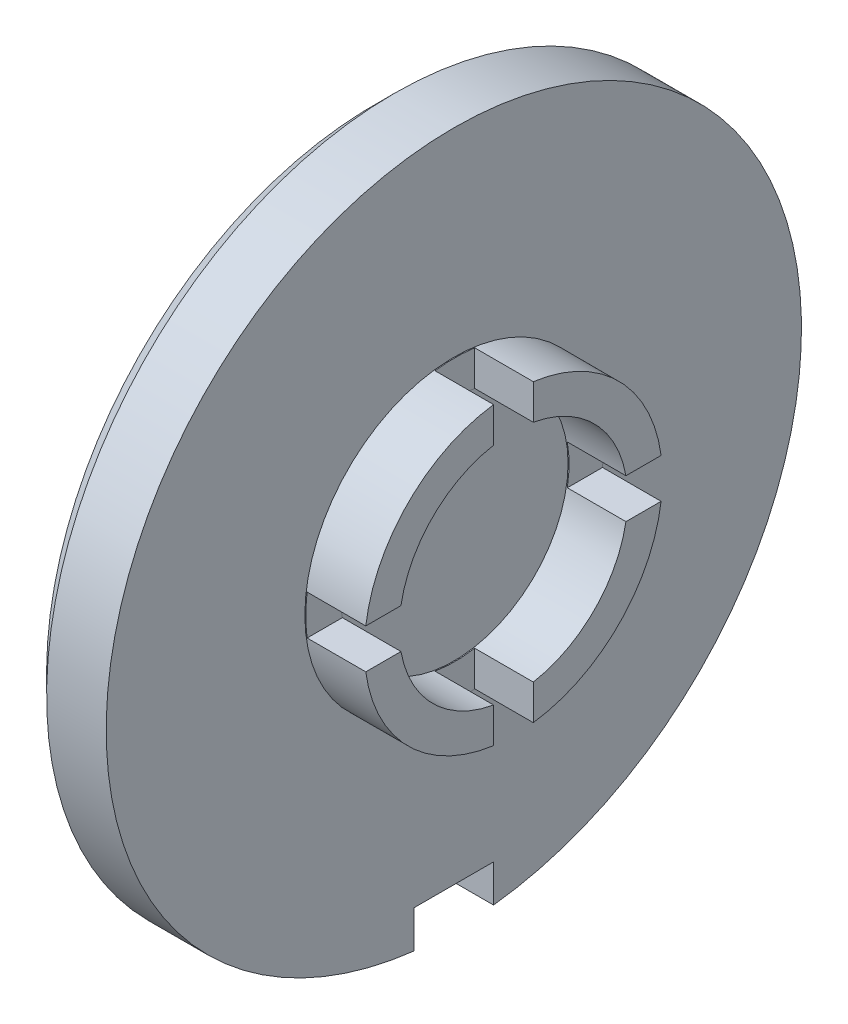
ISO-10303-21;
HEADER;
FILE_DESCRIPTION(('STEP AP214'),'2;1');
FILE_NAME('part.step','',(''),(''),'','','');
FILE_SCHEMA(('AUTOMOTIVE_DESIGN { 1 0 10303 214 1 1 1 1 }'));
ENDSEC;
DATA;
#1=APPLICATION_CONTEXT('core data for automotive mechanical design processes');
#2=APPLICATION_PROTOCOL_DEFINITION('international standard','automotive_design',2000,#1);
#3=PRODUCT_CONTEXT('',#1,'mechanical');
#4=PRODUCT('Part','Part','',(#3));
#5=PRODUCT_RELATED_PRODUCT_CATEGORY('part','',(#4));
#6=PRODUCT_DEFINITION_FORMATION('','',#4);
#7=PRODUCT_DEFINITION_CONTEXT('part definition',#1,'design');
#8=PRODUCT_DEFINITION('design','',#6,#7);
#9=PRODUCT_DEFINITION_SHAPE('','',#8);
#10=(LENGTH_UNIT() NAMED_UNIT(*) SI_UNIT(.MILLI.,.METRE.));
#11=(NAMED_UNIT(*) PLANE_ANGLE_UNIT() SI_UNIT($,.RADIAN.));
#12=(NAMED_UNIT(*) SI_UNIT($,.STERADIAN.) SOLID_ANGLE_UNIT());
#13=UNCERTAINTY_MEASURE_WITH_UNIT(LENGTH_MEASURE(1.E-05),#10,'distance_accuracy_value','');
#14=(GEOMETRIC_REPRESENTATION_CONTEXT(3) GLOBAL_UNCERTAINTY_ASSIGNED_CONTEXT((#13)) GLOBAL_UNIT_ASSIGNED_CONTEXT((#10,
#11,#12)) REPRESENTATION_CONTEXT('',''));
#15=CARTESIAN_POINT('',(0.,0.,0.));
#16=DIRECTION('',(0.,0.,1.));
#17=DIRECTION('',(1.,0.,0.));
#18=AXIS2_PLACEMENT_3D('',#15,#16,#17);
#19=CARTESIAN_POINT('',(-85.6,-65.,66.));
#20=DIRECTION('',(1.,0.,0.));
#21=DIRECTION('',(0.,0.,-1.));
#22=AXIS2_PLACEMENT_3D('',#19,#20,#21);
#23=PLANE('',#22);
#24=DIRECTION('',(0.,1.,0.));
#25=VECTOR('',#24,1.);
#26=CARTESIAN_POINT('',(-85.6,-65.,66.8));
#27=LINE('',#26,#25);
#28=CARTESIAN_POINT('',(-85.6,-71.5513357416637,66.8));
#29=VERTEX_POINT('',#28);
#30=CARTESIAN_POINT('',(-85.6,-71.2,66.8));
#31=VERTEX_POINT('',#30);
#32=EDGE_CURVE('E359',#29,#31,#27,.T.);
#33=ORIENTED_EDGE('',*,*,#32,.F.);
#34=CARTESIAN_POINT('',(-85.6,-65.,66.));
#35=DIRECTION('',(-1.,0.,0.));
#36=DIRECTION('',(0.,0.,1.));
#37=AXIS2_PLACEMENT_3D('',#34,#35,#36);
#38=CIRCLE('',#37,6.6);
#39=CARTESIAN_POINT('',(-85.6,-71.5513357416637,65.2));
#40=VERTEX_POINT('',#39);
#41=EDGE_CURVE('E260',#29,#40,#38,.T.);
#42=ORIENTED_EDGE('',*,*,#41,.T.);
#43=DIRECTION('',(0.,1.,0.));
#44=VECTOR('',#43,1.);
#45=CARTESIAN_POINT('',(-85.6,-65.,65.2));
#46=LINE('',#45,#44);
#47=CARTESIAN_POINT('',(-85.6,-71.2,65.2));
#48=VERTEX_POINT('',#47);
#49=EDGE_CURVE('E395',#40,#48,#46,.T.);
#50=ORIENTED_EDGE('',*,*,#49,.T.);
#51=DIRECTION('',(0.,0.,-1.));
#52=VECTOR('',#51,1.);
#53=CARTESIAN_POINT('',(-85.6,-71.2,66.));
#54=LINE('',#53,#52);
#55=EDGE_CURVE('E205',#31,#48,#54,.T.);
#56=ORIENTED_EDGE('',*,*,#55,.F.);
#57=EDGE_LOOP('',(#33,#42,#50,#56));
#58=FACE_BOUND('',#57,.T.);
#59=ADVANCED_FACE('F47',(#58),#23,.F.);
#60=CARTESIAN_POINT('',(-85.2,-65.,66.));
#61=DIRECTION('',(1.,0.,0.));
#62=DIRECTION('',(0.,0.,-1.));
#63=AXIS2_PLACEMENT_3D('',#60,#61,#62);
#64=CONICAL_SURFACE('',#63,7.,0.785398163397466);
#65=CARTESIAN_POINT('',(-84.3053728090001,-72.8539886990545,66.8));
#66=CARTESIAN_POINT('',(-84.4879933170182,-72.6704216279594,66.8));
#67=CARTESIAN_POINT('',(-84.6705824210977,-72.4868233002689,66.8));
#68=CARTESIAN_POINT('',(-85.0356779759848,-72.1195446095986,66.8));
#69=CARTESIAN_POINT('',(-85.2181844268204,-71.9358642466467,66.8));
#70=CARTESIAN_POINT('',(-85.5830949808418,-71.5684018115597,66.8));
#71=CARTESIAN_POINT('',(-85.7654990840124,-71.3846197394094,66.8));
#72=CARTESIAN_POINT('',(-86.1301724326838,-71.0169217300399,66.8));
#73=CARTESIAN_POINT('',(-86.3124416781385,-70.8330057927748,66.8));
#74=CARTESIAN_POINT('',(-86.4946271909999,-70.6490068941078,66.8));
#75=B_SPLINE_CURVE_WITH_KNOTS('',3,(#65,#66,#67,#68,#69,#70,#71,#72,#73,#74),.UNSPECIFIED.,.F.,
.F.,(4,2,2,2,4),(0.,0.776803766800077,1.55360727032155,2.33041088964957,3.10721477439802),.UNSPECIFIED.);
#76=CARTESIAN_POINT('',(-85.2,-71.9541354602855,66.8));
#77=VERTEX_POINT('',#76);
#78=EDGE_CURVE('E362',#77,#29,#75,.T.);
#79=ORIENTED_EDGE('',*,*,#78,.F.);
#80=CARTESIAN_POINT('',(-85.2,-65.,66.));
#81=DIRECTION('',(-1.,0.,0.));
#82=DIRECTION('',(0.,0.,1.));
#83=AXIS2_PLACEMENT_3D('',#80,#81,#82);
#84=CIRCLE('',#83,7.);
#85=CARTESIAN_POINT('',(-85.2,-71.9541354602855,65.2));
#86=VERTEX_POINT('',#85);
#87=EDGE_CURVE('E264',#77,#86,#84,.T.);
#88=ORIENTED_EDGE('',*,*,#87,.T.);
#89=CARTESIAN_POINT('',(-84.3053728090001,-72.8539886990545,65.2));
#90=CARTESIAN_POINT('',(-84.4879933170182,-72.6704216279594,65.2));
#91=CARTESIAN_POINT('',(-84.6705824210977,-72.4868233002689,65.2));
#92=CARTESIAN_POINT('',(-85.0356779759848,-72.1195446095986,65.2));
#93=CARTESIAN_POINT('',(-85.2181844268204,-71.9358642466467,65.2));
#94=CARTESIAN_POINT('',(-85.5830949808418,-71.5684018115597,65.2));
#95=CARTESIAN_POINT('',(-85.7654990840124,-71.3846197394094,65.2));
#96=CARTESIAN_POINT('',(-86.1301724326838,-71.0169217300399,65.2));
#97=CARTESIAN_POINT('',(-86.3124416781385,-70.8330057927748,65.2));
#98=CARTESIAN_POINT('',(-86.4946271909999,-70.6490068941078,65.2));
#99=B_SPLINE_CURVE_WITH_KNOTS('',3,(#89,#90,#91,#92,#93,#94,#95,#96,#97,#98),.UNSPECIFIED.,.F.,
.F.,(4,2,2,2,4),(0.,0.776803766800077,1.55360727032155,2.33041088964957,3.10721477439802),.UNSPECIFIED.);
#100=EDGE_CURVE('E387',#86,#40,#99,.T.);
#101=ORIENTED_EDGE('',*,*,#100,.T.);
#102=ORIENTED_EDGE('',*,*,#41,.F.);
#103=EDGE_LOOP('',(#79,#88,#101,#102));
#104=FACE_BOUND('',#103,.T.);
#105=ADVANCED_FACE('F373',(#104),#64,.T.);
#106=CARTESIAN_POINT('',(-90.6,-65.,66.));
#107=DIRECTION('',(-1.,0.,0.));
#108=DIRECTION('',(0.,0.,1.));
#109=AXIS2_PLACEMENT_3D('',#106,#107,#108);
#110=CYLINDRICAL_SURFACE('',#109,7.);
#111=DIRECTION('',(-1.,0.,0.));
#112=VECTOR('',#111,1.);
#113=CARTESIAN_POINT('',(-90.6,-71.9541354602855,66.8));
#114=LINE('',#113,#112);
#115=CARTESIAN_POINT('',(-84.,-71.9541354602855,66.8));
#116=VERTEX_POINT('',#115);
#117=EDGE_CURVE('E371',#116,#77,#114,.T.);
#118=ORIENTED_EDGE('',*,*,#117,.F.);
#119=CARTESIAN_POINT('',(-84.,-65.,66.));
#120=DIRECTION('',(-1.,0.,0.));
#121=DIRECTION('',(0.,0.,1.));
#122=AXIS2_PLACEMENT_3D('',#119,#120,#121);
#123=CIRCLE('',#122,7.);
#124=CARTESIAN_POINT('',(-84.,-71.9541354602855,65.2));
#125=VERTEX_POINT('',#124);
#126=EDGE_CURVE('E268',#116,#125,#123,.T.);
#127=ORIENTED_EDGE('',*,*,#126,.T.);
#128=DIRECTION('',(-1.,0.,0.));
#129=VECTOR('',#128,1.);
#130=CARTESIAN_POINT('',(-90.6,-71.9541354602855,65.2));
#131=LINE('',#130,#129);
#132=EDGE_CURVE('E63',#125,#86,#131,.T.);
#133=ORIENTED_EDGE('',*,*,#132,.T.);
#134=ORIENTED_EDGE('',*,*,#87,.F.);
#135=EDGE_LOOP('',(#118,#127,#133,#134));
#136=FACE_BOUND('',#135,.T.);
#137=ADVANCED_FACE('F406',(#136),#110,.T.);
#138=CARTESIAN_POINT('',(-84.,-58.,66.));
#139=DIRECTION('',(-1.,0.,0.));
#140=DIRECTION('',(0.,0.,1.));
#141=AXIS2_PLACEMENT_3D('',#138,#139,#140);
#142=PLANE('',#141);
#143=CARTESIAN_POINT('',(-84.,-65.,66.));
#144=DIRECTION('',(-1.,0.,0.));
#145=DIRECTION('',(0.,0.,1.));
#146=AXIS2_PLACEMENT_3D('',#143,#144,#145);
#147=CIRCLE('',#146,3.);
#148=CARTESIAN_POINT('',(-84.,-65.,69.));
#149=VERTEX_POINT('',#148);
#150=EDGE_CURVE('E271',#149,#149,#147,.T.);
#151=ORIENTED_EDGE('',*,*,#150,.T.);
#152=EDGE_LOOP('',(#151));
#153=FACE_BOUND('',#152,.T.);
#154=DIRECTION('',(0.,-1.,0.));
#155=VECTOR('',#154,1.);
#156=CARTESIAN_POINT('',(-84.,-58.,66.8));
#157=LINE('',#156,#155);
#158=CARTESIAN_POINT('',(-84.,-71.2,66.8));
#159=VERTEX_POINT('',#158);
#160=EDGE_CURVE('E11',#159,#116,#157,.T.);
#161=ORIENTED_EDGE('',*,*,#160,.F.);
#162=DIRECTION('',(0.,0.,1.));
#163=VECTOR('',#162,1.);
#164=CARTESIAN_POINT('',(-84.,-71.2,66.));
#165=LINE('',#164,#163);
#166=CARTESIAN_POINT('',(-84.,-71.2,65.2));
#167=VERTEX_POINT('',#166);
#168=EDGE_CURVE('E56',#167,#159,#165,.T.);
#169=ORIENTED_EDGE('',*,*,#168,.F.);
#170=DIRECTION('',(0.,-1.,0.));
#171=VECTOR('',#170,1.);
#172=CARTESIAN_POINT('',(-84.,-58.,65.2));
#173=LINE('',#172,#171);
#174=EDGE_CURVE('E188',#167,#125,#173,.T.);
#175=ORIENTED_EDGE('',*,*,#174,.T.);
#176=ORIENTED_EDGE('',*,*,#126,.F.);
#177=EDGE_LOOP('',(#161,#169,#175,#176));
#178=FACE_BOUND('',#177,.T.);
#179=ADVANCED_FACE('F210',(#153,#178),#142,.F.);
#180=CARTESIAN_POINT('',(-82.8,-62.,66.));
#181=DIRECTION('',(-1.,0.,0.));
#182=DIRECTION('',(0.,0.,1.));
#183=AXIS2_PLACEMENT_3D('',#180,#181,#182);
#184=PLANE('',#183);
#185=DIRECTION('',(0.,-1.,0.));
#186=VECTOR('',#185,1.);
#187=CARTESIAN_POINT('',(-82.8,-62.,66.4));
#188=LINE('',#187,#186);
#189=CARTESIAN_POINT('',(-82.8,-67.2649503305812,66.4));
#190=VERTEX_POINT('',#189);
#191=CARTESIAN_POINT('',(-82.8,-67.9732137494637,66.4));
#192=VERTEX_POINT('',#191);
#193=EDGE_CURVE('E324',#190,#192,#188,.T.);
#194=ORIENTED_EDGE('',*,*,#193,.F.);
#195=CARTESIAN_POINT('',(-82.8,-65.,66.));
#196=DIRECTION('',(-1.,0.,0.));
#197=DIRECTION('',(0.,0.,1.));
#198=AXIS2_PLACEMENT_3D('',#195,#196,#197);
#199=CIRCLE('',#198,2.3);
#200=CARTESIAN_POINT('',(-82.8,-65.4,68.2649503305812));
#201=VERTEX_POINT('',#200);
#202=EDGE_CURVE('E259',#190,#201,#199,.T.);
#203=ORIENTED_EDGE('',*,*,#202,.T.);
#204=DIRECTION('',(0.,0.,-1.));
#205=VECTOR('',#204,1.);
#206=CARTESIAN_POINT('',(-82.8,-65.4,66.));
#207=LINE('',#206,#205);
#208=CARTESIAN_POINT('',(-82.8,-65.4,68.9732137494637));
#209=VERTEX_POINT('',#208);
#210=EDGE_CURVE('E293',#209,#201,#207,.T.);
#211=ORIENTED_EDGE('',*,*,#210,.F.);
#212=CARTESIAN_POINT('',(-82.8,-65.,66.));
#213=DIRECTION('',(-1.,0.,0.));
#214=DIRECTION('',(0.,0.,1.));
#215=AXIS2_PLACEMENT_3D('',#212,#213,#214);
#216=CIRCLE('',#215,3.);
#217=EDGE_CURVE('E280',#192,#209,#216,.T.);
#218=ORIENTED_EDGE('',*,*,#217,.F.);
#219=EDGE_LOOP('',(#194,#203,#211,#218));
#220=FACE_BOUND('',#219,.T.);
#221=ADVANCED_FACE('F431',(#220),#184,.F.);
#222=DIRECTION('',(0.,-1.,0.));
#223=VECTOR('',#222,1.);
#224=CARTESIAN_POINT('',(-82.8,-62.,66.4));
#225=LINE('',#224,#223);
#226=CARTESIAN_POINT('',(-82.8,-62.0267862505363,66.4));
#227=VERTEX_POINT('',#226);
#228=CARTESIAN_POINT('',(-82.8,-62.7350496694188,66.4));
#229=VERTEX_POINT('',#228);
#230=EDGE_CURVE('E330',#227,#229,#225,.T.);
#231=ORIENTED_EDGE('',*,*,#230,.F.);
#232=CARTESIAN_POINT('',(-82.8,-64.6,68.9732137494637));
#233=VERTEX_POINT('',#232);
#234=EDGE_CURVE('E275',#233,#227,#216,.T.);
#235=ORIENTED_EDGE('',*,*,#234,.F.);
#236=DIRECTION('',(0.,0.,1.));
#237=VECTOR('',#236,1.);
#238=CARTESIAN_POINT('',(-82.8,-64.6,66.));
#239=LINE('',#238,#237);
#240=CARTESIAN_POINT('',(-82.8,-64.6,68.2649503305812));
#241=VERTEX_POINT('',#240);
#242=EDGE_CURVE('E300',#241,#233,#239,.T.);
#243=ORIENTED_EDGE('',*,*,#242,.F.);
#244=EDGE_CURVE('E249',#241,#229,#199,.T.);
#245=ORIENTED_EDGE('',*,*,#244,.T.);
#246=EDGE_LOOP('',(#231,#235,#243,#245));
#247=FACE_BOUND('',#246,.T.);
#248=ADVANCED_FACE('F423',(#247),#184,.F.);
#249=CARTESIAN_POINT('',(-90.6,-65.,66.));
#250=DIRECTION('',(-1.,0.,0.));
#251=DIRECTION('',(0.,0.,1.));
#252=AXIS2_PLACEMENT_3D('',#249,#250,#251);
#253=CYLINDRICAL_SURFACE('',#252,2.3);
#254=CARTESIAN_POINT('',(-84.,-65.,66.));
#255=DIRECTION('',(-1.,0.,0.));
#256=DIRECTION('',(0.,0.,1.));
#257=AXIS2_PLACEMENT_3D('',#254,#255,#256);
#258=CIRCLE('',#257,2.3);
#259=CARTESIAN_POINT('',(-84.,-65.,68.3));
#260=VERTEX_POINT('',#259);
#261=EDGE_CURVE('E255',#260,#260,#258,.T.);
#262=ORIENTED_EDGE('',*,*,#261,.T.);
#263=EDGE_LOOP('',(#262));
#264=FACE_BOUND('',#263,.T.);
#265=DIRECTION('',(-1.,0.,0.));
#266=VECTOR('',#265,1.);
#267=CARTESIAN_POINT('',(-90.6,-67.2649503305812,66.4));
#268=LINE('',#267,#266);
#269=CARTESIAN_POINT('',(-83.98,-67.2649503305812,66.4));
#270=VERTEX_POINT('',#269);
#271=EDGE_CURVE('E321',#270,#190,#268,.F.);
#272=ORIENTED_EDGE('',*,*,#271,.F.);
#273=CARTESIAN_POINT('',(-83.98,-65.,66.));
#274=DIRECTION('',(1.,0.,0.));
#275=DIRECTION('',(0.,0.,-1.));
#276=AXIS2_PLACEMENT_3D('',#273,#274,#275);
#277=CIRCLE('',#276,2.3);
#278=CARTESIAN_POINT('',(-83.98,-67.2649503305812,65.6));
#279=VERTEX_POINT('',#278);
#280=EDGE_CURVE('E317',#279,#270,#277,.F.);
#281=ORIENTED_EDGE('',*,*,#280,.F.);
#282=DIRECTION('',(-1.,0.,0.));
#283=VECTOR('',#282,1.);
#284=CARTESIAN_POINT('',(-90.6,-67.2649503305812,65.6));
#285=LINE('',#284,#283);
#286=CARTESIAN_POINT('',(-82.8,-67.2649503305812,65.6));
#287=VERTEX_POINT('',#286);
#288=EDGE_CURVE('E333',#279,#287,#285,.F.);
#289=ORIENTED_EDGE('',*,*,#288,.T.);
#290=CARTESIAN_POINT('',(-82.8,-65.4,63.7350496694188));
#291=VERTEX_POINT('',#290);
#292=EDGE_CURVE('E254',#291,#287,#199,.T.);
#293=ORIENTED_EDGE('',*,*,#292,.F.);
#294=DIRECTION('',(-1.,0.,0.));
#295=VECTOR('',#294,1.);
#296=CARTESIAN_POINT('',(-90.6,-65.4,63.7350496694188));
#297=LINE('',#296,#295);
#298=CARTESIAN_POINT('',(-83.98,-65.4,63.7350496694188));
#299=VERTEX_POINT('',#298);
#300=EDGE_CURVE('E286',#299,#291,#297,.F.);
#301=ORIENTED_EDGE('',*,*,#300,.F.);
#302=CARTESIAN_POINT('',(-83.98,-65.,66.));
#303=DIRECTION('',(1.,0.,0.));
#304=DIRECTION('',(0.,0.,-1.));
#305=AXIS2_PLACEMENT_3D('',#302,#303,#304);
#306=CIRCLE('',#305,2.3);
#307=CARTESIAN_POINT('',(-83.98,-64.6,63.7350496694188));
#308=VERTEX_POINT('',#307);
#309=EDGE_CURVE('E282',#308,#299,#306,.F.);
#310=ORIENTED_EDGE('',*,*,#309,.F.);
#311=DIRECTION('',(-1.,0.,0.));
#312=VECTOR('',#311,1.);
#313=CARTESIAN_POINT('',(-90.6,-64.6,63.7350496694188));
#314=LINE('',#313,#312);
#315=CARTESIAN_POINT('',(-82.8,-64.6,63.7350496694188));
#316=VERTEX_POINT('',#315);
#317=EDGE_CURVE('E301',#316,#308,#314,.T.);
#318=ORIENTED_EDGE('',*,*,#317,.F.);
#319=CARTESIAN_POINT('',(-82.8,-62.7350496694188,65.6));
#320=VERTEX_POINT('',#319);
#321=EDGE_CURVE('E253',#320,#316,#199,.T.);
#322=ORIENTED_EDGE('',*,*,#321,.F.);
#323=DIRECTION('',(-1.,0.,0.));
#324=VECTOR('',#323,1.);
#325=CARTESIAN_POINT('',(-90.6,-62.7350496694188,65.6));
#326=LINE('',#325,#324);
#327=CARTESIAN_POINT('',(-83.98,-62.7350496694188,65.6));
#328=VERTEX_POINT('',#327);
#329=EDGE_CURVE('E341',#320,#328,#326,.T.);
#330=ORIENTED_EDGE('',*,*,#329,.T.);
#331=CARTESIAN_POINT('',(-83.98,-62.7350496694188,66.4));
#332=VERTEX_POINT('',#331);
#333=EDGE_CURVE('E318',#332,#328,#277,.F.);
#334=ORIENTED_EDGE('',*,*,#333,.F.);
#335=DIRECTION('',(-1.,0.,0.));
#336=VECTOR('',#335,1.);
#337=CARTESIAN_POINT('',(-90.6,-62.7350496694188,66.4));
#338=LINE('',#337,#336);
#339=EDGE_CURVE('E327',#229,#332,#338,.T.);
#340=ORIENTED_EDGE('',*,*,#339,.F.);
#341=ORIENTED_EDGE('',*,*,#244,.F.);
#342=DIRECTION('',(-1.,0.,0.));
#343=VECTOR('',#342,1.);
#344=CARTESIAN_POINT('',(-90.6,-64.6,68.2649503305812));
#345=LINE('',#344,#343);
#346=CARTESIAN_POINT('',(-83.98,-64.6,68.2649503305812));
#347=VERTEX_POINT('',#346);
#348=EDGE_CURVE('E297',#347,#241,#345,.F.);
#349=ORIENTED_EDGE('',*,*,#348,.F.);
#350=CARTESIAN_POINT('',(-83.98,-65.4,68.2649503305812));
#351=VERTEX_POINT('',#350);
#352=EDGE_CURVE('E285',#351,#347,#306,.F.);
#353=ORIENTED_EDGE('',*,*,#352,.F.);
#354=DIRECTION('',(-1.,0.,0.));
#355=VECTOR('',#354,1.);
#356=CARTESIAN_POINT('',(-90.6,-65.4,68.2649503305812));
#357=LINE('',#356,#355);
#358=EDGE_CURVE('E290',#201,#351,#357,.T.);
#359=ORIENTED_EDGE('',*,*,#358,.F.);
#360=ORIENTED_EDGE('',*,*,#202,.F.);
#361=EDGE_LOOP('',(#272,#281,#289,#293,#301,#310,#318,#322,#330,#334,#340,#341,#349,#353,#359,#360));
#362=FACE_BOUND('',#361,.T.);
#363=ADVANCED_FACE('F420',(#264,#362),#253,.F.);
#364=CARTESIAN_POINT('',(-90.6,-65.,66.));
#365=DIRECTION('',(-1.,0.,0.));
#366=DIRECTION('',(0.,0.,1.));
#367=AXIS2_PLACEMENT_3D('',#364,#365,#366);
#368=CYLINDRICAL_SURFACE('',#367,3.);
#369=ORIENTED_EDGE('',*,*,#150,.F.);
#370=EDGE_LOOP('',(#369));
#371=FACE_BOUND('',#370,.T.);
#372=DIRECTION('',(-1.,0.,0.));
#373=VECTOR('',#372,1.);
#374=CARTESIAN_POINT('',(-90.6,-67.9732137494637,66.4));
#375=LINE('',#374,#373);
#376=CARTESIAN_POINT('',(-83.98,-67.9732137494637,66.4));
#377=VERTEX_POINT('',#376);
#378=EDGE_CURVE('E198',#192,#377,#375,.T.);
#379=ORIENTED_EDGE('',*,*,#378,.F.);
#380=ORIENTED_EDGE('',*,*,#217,.T.);
#381=DIRECTION('',(-1.,0.,0.));
#382=VECTOR('',#381,1.);
#383=CARTESIAN_POINT('',(-90.6,-65.4,68.9732137494637));
#384=LINE('',#383,#382);
#385=CARTESIAN_POINT('',(-83.98,-65.4,68.9732137494637));
#386=VERTEX_POINT('',#385);
#387=EDGE_CURVE('E230',#386,#209,#384,.F.);
#388=ORIENTED_EDGE('',*,*,#387,.F.);
#389=CARTESIAN_POINT('',(-83.98,-65.,66.));
#390=DIRECTION('',(1.,0.,0.));
#391=DIRECTION('',(0.,0.,-1.));
#392=AXIS2_PLACEMENT_3D('',#389,#390,#391);
#393=CIRCLE('',#392,3.);
#394=CARTESIAN_POINT('',(-83.98,-64.6,68.9732137494637));
#395=VERTEX_POINT('',#394);
#396=EDGE_CURVE('E234',#395,#386,#393,.T.);
#397=ORIENTED_EDGE('',*,*,#396,.F.);
#398=DIRECTION('',(-1.,0.,0.));
#399=VECTOR('',#398,1.);
#400=CARTESIAN_POINT('',(-90.6,-64.6,68.9732137494637));
#401=LINE('',#400,#399);
#402=EDGE_CURVE('E235',#233,#395,#401,.T.);
#403=ORIENTED_EDGE('',*,*,#402,.F.);
#404=ORIENTED_EDGE('',*,*,#234,.T.);
#405=DIRECTION('',(-1.,0.,0.));
#406=VECTOR('',#405,1.);
#407=CARTESIAN_POINT('',(-90.6,-62.0267862505363,66.4));
#408=LINE('',#407,#406);
#409=CARTESIAN_POINT('',(-83.98,-62.0267862505363,66.4));
#410=VERTEX_POINT('',#409);
#411=EDGE_CURVE('E220',#410,#227,#408,.F.);
#412=ORIENTED_EDGE('',*,*,#411,.F.);
#413=CARTESIAN_POINT('',(-83.98,-65.,66.));
#414=DIRECTION('',(1.,0.,0.));
#415=DIRECTION('',(0.,0.,-1.));
#416=AXIS2_PLACEMENT_3D('',#413,#414,#415);
#417=CIRCLE('',#416,3.);
#418=CARTESIAN_POINT('',(-83.98,-62.0267862505363,65.6));
#419=VERTEX_POINT('',#418);
#420=EDGE_CURVE('E223',#419,#410,#417,.T.);
#421=ORIENTED_EDGE('',*,*,#420,.F.);
#422=DIRECTION('',(-1.,0.,0.));
#423=VECTOR('',#422,1.);
#424=CARTESIAN_POINT('',(-90.6,-62.0267862505363,65.6));
#425=LINE('',#424,#423);
#426=CARTESIAN_POINT('',(-82.8,-62.0267862505363,65.6));
#427=VERTEX_POINT('',#426);
#428=EDGE_CURVE('E226',#419,#427,#425,.F.);
#429=ORIENTED_EDGE('',*,*,#428,.T.);
#430=CARTESIAN_POINT('',(-82.8,-64.6,63.0267862505363));
#431=VERTEX_POINT('',#430);
#432=EDGE_CURVE('E279',#427,#431,#216,.T.);
#433=ORIENTED_EDGE('',*,*,#432,.T.);
#434=DIRECTION('',(-1.,0.,0.));
#435=VECTOR('',#434,1.);
#436=CARTESIAN_POINT('',(-90.6,-64.6,63.0267862505363));
#437=LINE('',#436,#435);
#438=CARTESIAN_POINT('',(-83.98,-64.6,63.0267862505363));
#439=VERTEX_POINT('',#438);
#440=EDGE_CURVE('E245',#439,#431,#437,.F.);
#441=ORIENTED_EDGE('',*,*,#440,.F.);
#442=CARTESIAN_POINT('',(-83.98,-65.4,63.0267862505363));
#443=VERTEX_POINT('',#442);
#444=EDGE_CURVE('E241',#443,#439,#393,.T.);
#445=ORIENTED_EDGE('',*,*,#444,.F.);
#446=DIRECTION('',(-1.,0.,0.));
#447=VECTOR('',#446,1.);
#448=CARTESIAN_POINT('',(-90.6,-65.4,63.0267862505363));
#449=LINE('',#448,#447);
#450=CARTESIAN_POINT('',(-82.8,-65.4,63.0267862505363));
#451=VERTEX_POINT('',#450);
#452=EDGE_CURVE('E238',#451,#443,#449,.T.);
#453=ORIENTED_EDGE('',*,*,#452,.F.);
#454=CARTESIAN_POINT('',(-82.8,-67.9732137494637,65.6));
#455=VERTEX_POINT('',#454);
#456=EDGE_CURVE('E281',#451,#455,#216,.T.);
#457=ORIENTED_EDGE('',*,*,#456,.T.);
#458=DIRECTION('',(-1.,0.,0.));
#459=VECTOR('',#458,1.);
#460=CARTESIAN_POINT('',(-90.6,-67.9732137494637,65.6));
#461=LINE('',#460,#459);
#462=CARTESIAN_POINT('',(-83.98,-67.9732137494637,65.6));
#463=VERTEX_POINT('',#462);
#464=EDGE_CURVE('E216',#455,#463,#461,.T.);
#465=ORIENTED_EDGE('',*,*,#464,.T.);
#466=EDGE_CURVE('E215',#377,#463,#417,.T.);
#467=ORIENTED_EDGE('',*,*,#466,.F.);
#468=EDGE_LOOP('',(#379,#380,#388,#397,#403,#404,#412,#421,#429,#433,#441,#445,#453,#457,#465,#467));
#469=FACE_BOUND('',#468,.T.);
#470=ADVANCED_FACE('F422',(#371,#469),#368,.T.);
#471=ORIENTED_EDGE('',*,*,#292,.T.);
#472=DIRECTION('',(0.,-1.,0.));
#473=VECTOR('',#472,1.);
#474=CARTESIAN_POINT('',(-82.8,-62.,65.6));
#475=LINE('',#474,#473);
#476=EDGE_CURVE('E337',#287,#455,#475,.T.);
#477=ORIENTED_EDGE('',*,*,#476,.T.);
#478=ORIENTED_EDGE('',*,*,#456,.F.);
#479=EDGE_CURVE('E289',#291,#451,#207,.T.);
#480=ORIENTED_EDGE('',*,*,#479,.F.);
#481=EDGE_LOOP('',(#471,#477,#478,#480));
#482=FACE_BOUND('',#481,.T.);
#483=ADVANCED_FACE('F49',(#482),#184,.F.);
#484=ORIENTED_EDGE('',*,*,#432,.F.);
#485=DIRECTION('',(0.,-1.,0.));
#486=VECTOR('',#485,1.);
#487=CARTESIAN_POINT('',(-82.8,-62.,65.6));
#488=LINE('',#487,#486);
#489=EDGE_CURVE('E345',#427,#320,#488,.T.);
#490=ORIENTED_EDGE('',*,*,#489,.T.);
#491=ORIENTED_EDGE('',*,*,#321,.T.);
#492=EDGE_CURVE('E304',#431,#316,#239,.T.);
#493=ORIENTED_EDGE('',*,*,#492,.F.);
#494=EDGE_LOOP('',(#484,#490,#491,#493));
#495=FACE_BOUND('',#494,.T.);
#496=ADVANCED_FACE('F418',(#495),#184,.F.);
#497=CARTESIAN_POINT('',(-84.,-62.7,66.));
#498=DIRECTION('',(-1.,0.,0.));
#499=DIRECTION('',(0.,0.,1.));
#500=AXIS2_PLACEMENT_3D('',#497,#498,#499);
#501=PLANE('',#500);
#502=ORIENTED_EDGE('',*,*,#261,.F.);
#503=EDGE_LOOP('',(#502));
#504=FACE_BOUND('',#503,.T.);
#505=ADVANCED_FACE('F415',(#504),#501,.F.);
#506=CARTESIAN_POINT('',(-83.98,-65.4,69.2));
#507=DIRECTION('',(0.,1.,0.));
#508=DIRECTION('',(0.,0.,1.));
#509=AXIS2_PLACEMENT_3D('',#506,#507,#508);
#510=PLANE('',#509);
#511=ORIENTED_EDGE('',*,*,#300,.T.);
#512=ORIENTED_EDGE('',*,*,#479,.T.);
#513=ORIENTED_EDGE('',*,*,#452,.T.);
#514=DIRECTION('',(0.,0.,-1.));
#515=VECTOR('',#514,1.);
#516=CARTESIAN_POINT('',(-83.98,-65.4,69.2));
#517=LINE('',#516,#515);
#518=EDGE_CURVE('E309',#299,#443,#517,.T.);
#519=ORIENTED_EDGE('',*,*,#518,.F.);
#520=EDGE_LOOP('',(#511,#512,#513,#519));
#521=FACE_BOUND('',#520,.T.);
#522=ADVANCED_FACE('F417',(#521),#510,.T.);
#523=CARTESIAN_POINT('',(-83.98,-64.6,69.2));
#524=DIRECTION('',(0.,-1.,0.));
#525=DIRECTION('',(0.,0.,-1.));
#526=AXIS2_PLACEMENT_3D('',#523,#524,#525);
#527=PLANE('',#526);
#528=ORIENTED_EDGE('',*,*,#317,.T.);
#529=DIRECTION('',(0.,0.,-1.));
#530=VECTOR('',#529,1.);
#531=CARTESIAN_POINT('',(-83.98,-64.6,69.2));
#532=LINE('',#531,#530);
#533=EDGE_CURVE('E314',#308,#439,#532,.T.);
#534=ORIENTED_EDGE('',*,*,#533,.T.);
#535=ORIENTED_EDGE('',*,*,#440,.T.);
#536=ORIENTED_EDGE('',*,*,#492,.T.);
#537=EDGE_LOOP('',(#528,#534,#535,#536));
#538=FACE_BOUND('',#537,.T.);
#539=ADVANCED_FACE('F461',(#538),#527,.T.);
#540=CARTESIAN_POINT('',(-83.98,-65.4,69.2));
#541=DIRECTION('',(1.,0.,0.));
#542=DIRECTION('',(0.,0.,-1.));
#543=AXIS2_PLACEMENT_3D('',#540,#541,#542);
#544=PLANE('',#543);
#545=ORIENTED_EDGE('',*,*,#309,.T.);
#546=ORIENTED_EDGE('',*,*,#518,.T.);
#547=ORIENTED_EDGE('',*,*,#444,.T.);
#548=ORIENTED_EDGE('',*,*,#533,.F.);
#549=EDGE_LOOP('',(#545,#546,#547,#548));
#550=FACE_BOUND('',#549,.T.);
#551=ADVANCED_FACE('F484',(#550),#544,.T.);
#552=ORIENTED_EDGE('',*,*,#352,.T.);
#553=EDGE_CURVE('E313',#395,#347,#532,.T.);
#554=ORIENTED_EDGE('',*,*,#553,.F.);
#555=ORIENTED_EDGE('',*,*,#396,.T.);
#556=EDGE_CURVE('E308',#386,#351,#517,.T.);
#557=ORIENTED_EDGE('',*,*,#556,.T.);
#558=EDGE_LOOP('',(#552,#554,#555,#557));
#559=FACE_BOUND('',#558,.T.);
#560=ADVANCED_FACE('F486',(#559),#544,.T.);
#561=ORIENTED_EDGE('',*,*,#358,.T.);
#562=ORIENTED_EDGE('',*,*,#556,.F.);
#563=ORIENTED_EDGE('',*,*,#387,.T.);
#564=ORIENTED_EDGE('',*,*,#210,.T.);
#565=EDGE_LOOP('',(#561,#562,#563,#564));
#566=FACE_BOUND('',#565,.T.);
#567=ADVANCED_FACE('F491',(#566),#510,.T.);
#568=ORIENTED_EDGE('',*,*,#348,.T.);
#569=ORIENTED_EDGE('',*,*,#242,.T.);
#570=ORIENTED_EDGE('',*,*,#402,.T.);
#571=ORIENTED_EDGE('',*,*,#553,.T.);
#572=EDGE_LOOP('',(#568,#569,#570,#571));
#573=FACE_BOUND('',#572,.T.);
#574=ADVANCED_FACE('F495',(#573),#527,.T.);
#575=CARTESIAN_POINT('',(0.,0.,65.6));
#576=DIRECTION('',(0.,0.,-1.));
#577=DIRECTION('',(-1.,0.,0.));
#578=AXIS2_PLACEMENT_3D('',#575,#576,#577);
#579=PLANE('',#578);
#580=ORIENTED_EDGE('',*,*,#489,.F.);
#581=ORIENTED_EDGE('',*,*,#428,.F.);
#582=DIRECTION('',(0.,-1.,0.));
#583=VECTOR('',#582,1.);
#584=CARTESIAN_POINT('',(-83.98,-68.2,65.6));
#585=LINE('',#584,#583);
#586=EDGE_CURVE('E352',#419,#328,#585,.T.);
#587=ORIENTED_EDGE('',*,*,#586,.T.);
#588=ORIENTED_EDGE('',*,*,#329,.F.);
#589=EDGE_LOOP('',(#580,#581,#587,#588));
#590=FACE_BOUND('',#589,.T.);
#591=ADVANCED_FACE('F573',(#590),#579,.F.);
#592=CARTESIAN_POINT('',(0.,0.,66.4));
#593=DIRECTION('',(0.,0.,-1.));
#594=DIRECTION('',(-1.,0.,0.));
#595=AXIS2_PLACEMENT_3D('',#592,#593,#594);
#596=PLANE('',#595);
#597=ORIENTED_EDGE('',*,*,#339,.T.);
#598=DIRECTION('',(0.,-1.,0.));
#599=VECTOR('',#598,1.);
#600=CARTESIAN_POINT('',(-83.98,-68.2,66.4));
#601=LINE('',#600,#599);
#602=EDGE_CURVE('E349',#410,#332,#601,.T.);
#603=ORIENTED_EDGE('',*,*,#602,.F.);
#604=ORIENTED_EDGE('',*,*,#411,.T.);
#605=ORIENTED_EDGE('',*,*,#230,.T.);
#606=EDGE_LOOP('',(#597,#603,#604,#605));
#607=FACE_BOUND('',#606,.T.);
#608=ADVANCED_FACE('F591',(#607),#596,.T.);
#609=CARTESIAN_POINT('',(-83.98,-68.2,66.4));
#610=DIRECTION('',(1.,0.,0.));
#611=DIRECTION('',(0.,0.,-1.));
#612=AXIS2_PLACEMENT_3D('',#609,#610,#611);
#613=PLANE('',#612);
#614=ORIENTED_EDGE('',*,*,#333,.T.);
#615=ORIENTED_EDGE('',*,*,#586,.F.);
#616=ORIENTED_EDGE('',*,*,#420,.T.);
#617=ORIENTED_EDGE('',*,*,#602,.T.);
#618=EDGE_LOOP('',(#614,#615,#616,#617));
#619=FACE_BOUND('',#618,.T.);
#620=ADVANCED_FACE('F600',(#619),#613,.T.);
#621=ORIENTED_EDGE('',*,*,#280,.T.);
#622=EDGE_CURVE('E353',#270,#377,#601,.T.);
#623=ORIENTED_EDGE('',*,*,#622,.T.);
#624=ORIENTED_EDGE('',*,*,#466,.T.);
#625=EDGE_CURVE('E71',#279,#463,#585,.T.);
#626=ORIENTED_EDGE('',*,*,#625,.F.);
#627=EDGE_LOOP('',(#621,#623,#624,#626));
#628=FACE_BOUND('',#627,.T.);
#629=ADVANCED_FACE('F477',(#628),#613,.T.);
#630=ORIENTED_EDGE('',*,*,#271,.T.);
#631=ORIENTED_EDGE('',*,*,#193,.T.);
#632=ORIENTED_EDGE('',*,*,#378,.T.);
#633=ORIENTED_EDGE('',*,*,#622,.F.);
#634=EDGE_LOOP('',(#630,#631,#632,#633));
#635=FACE_BOUND('',#634,.T.);
#636=ADVANCED_FACE('F442',(#635),#596,.T.);
#637=ORIENTED_EDGE('',*,*,#625,.T.);
#638=ORIENTED_EDGE('',*,*,#464,.F.);
#639=ORIENTED_EDGE('',*,*,#476,.F.);
#640=ORIENTED_EDGE('',*,*,#288,.F.);
#641=EDGE_LOOP('',(#637,#638,#639,#640));
#642=FACE_BOUND('',#641,.T.);
#643=ADVANCED_FACE('F475',(#642),#579,.F.);
#644=CARTESIAN_POINT('',(-85.7,-71.2,66.8));
#645=DIRECTION('',(0.,-1.,0.));
#646=DIRECTION('',(0.,0.,-1.));
#647=AXIS2_PLACEMENT_3D('',#644,#645,#646);
#648=PLANE('',#647);
#649=ORIENTED_EDGE('',*,*,#55,.T.);
#650=DIRECTION('',(-1.,0.,0.));
#651=VECTOR('',#650,1.);
#652=CARTESIAN_POINT('',(-85.7,-71.2,65.2));
#653=LINE('',#652,#651);
#654=EDGE_CURVE('E191',#167,#48,#653,.T.);
#655=ORIENTED_EDGE('',*,*,#654,.F.);
#656=ORIENTED_EDGE('',*,*,#168,.T.);
#657=DIRECTION('',(-1.,0.,0.));
#658=VECTOR('',#657,1.);
#659=CARTESIAN_POINT('',(-85.7,-71.2,66.8));
#660=LINE('',#659,#658);
#661=EDGE_CURVE('E207',#159,#31,#660,.T.);
#662=ORIENTED_EDGE('',*,*,#661,.T.);
#663=EDGE_LOOP('',(#649,#655,#656,#662));
#664=FACE_BOUND('',#663,.T.);
#665=ADVANCED_FACE('F201',(#664),#648,.T.);
#666=CARTESIAN_POINT('',(0.,0.,66.8));
#667=DIRECTION('',(0.,0.,-1.));
#668=DIRECTION('',(-1.,0.,0.));
#669=AXIS2_PLACEMENT_3D('',#666,#667,#668);
#670=PLANE('',#669);
#671=ORIENTED_EDGE('',*,*,#32,.T.);
#672=ORIENTED_EDGE('',*,*,#661,.F.);
#673=ORIENTED_EDGE('',*,*,#160,.T.);
#674=ORIENTED_EDGE('',*,*,#117,.T.);
#675=ORIENTED_EDGE('',*,*,#78,.T.);
#676=EDGE_LOOP('',(#671,#672,#673,#674,#675));
#677=FACE_BOUND('',#676,.T.);
#678=ADVANCED_FACE('F377',(#677),#670,.T.);
#679=CARTESIAN_POINT('',(0.,0.,65.2));
#680=DIRECTION('',(0.,0.,-1.));
#681=DIRECTION('',(-1.,0.,0.));
#682=AXIS2_PLACEMENT_3D('',#679,#680,#681);
#683=PLANE('',#682);
#684=ORIENTED_EDGE('',*,*,#100,.F.);
#685=ORIENTED_EDGE('',*,*,#132,.F.);
#686=ORIENTED_EDGE('',*,*,#174,.F.);
#687=ORIENTED_EDGE('',*,*,#654,.T.);
#688=ORIENTED_EDGE('',*,*,#49,.F.);
#689=EDGE_LOOP('',(#684,#685,#686,#687,#688));
#690=FACE_BOUND('',#689,.T.);
#691=ADVANCED_FACE('F190',(#690),#683,.F.);
#692=CLOSED_SHELL('',(#59,#105,#137,#179,#221,#248,#363,#470,#483,#496,#505,#522,#539,#551,#560,
#567,#574,#591,#608,#620,#629,#636,#643,#665,#678,#691));
#693=MANIFOLD_SOLID_BREP('B2',#692);
#694=ADVANCED_BREP_SHAPE_REPRESENTATION('',(#18,#693),#14);
#695=SHAPE_DEFINITION_REPRESENTATION(#9,#694);
ENDSEC;
END-ISO-10303-21;
